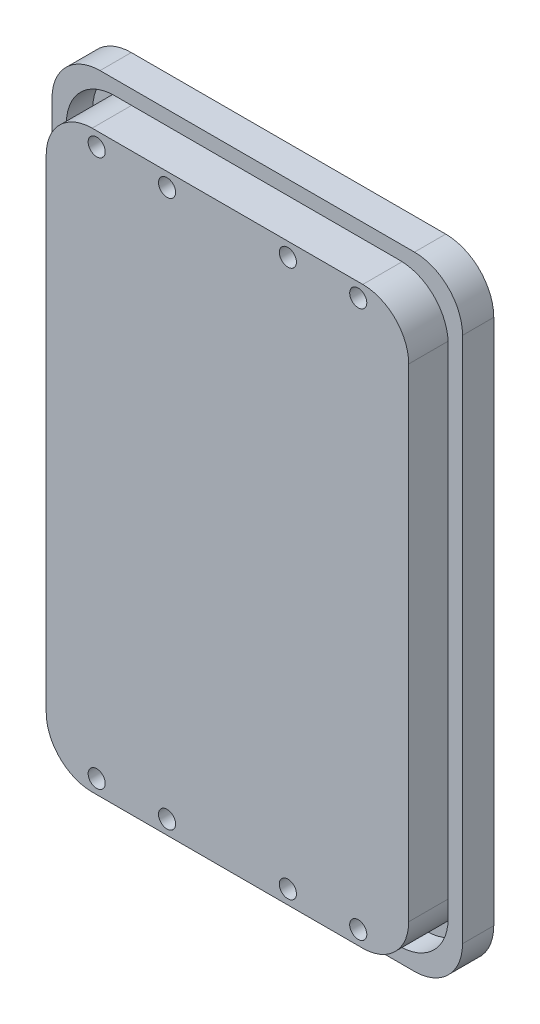
ISO-10303-21;
HEADER;
FILE_DESCRIPTION(('STEP AP214'),'2;1');
FILE_NAME('part.step','',(''),(''),'','','');
FILE_SCHEMA(('AUTOMOTIVE_DESIGN { 1 0 10303 214 1 1 1 1 }'));
ENDSEC;
DATA;
#1=APPLICATION_CONTEXT('core data for automotive mechanical design processes');
#2=APPLICATION_PROTOCOL_DEFINITION('international standard','automotive_design',2000,#1);
#3=PRODUCT_CONTEXT('',#1,'mechanical');
#4=PRODUCT('Part','Part','',(#3));
#5=PRODUCT_RELATED_PRODUCT_CATEGORY('part','',(#4));
#6=PRODUCT_DEFINITION_FORMATION('','',#4);
#7=PRODUCT_DEFINITION_CONTEXT('part definition',#1,'design');
#8=PRODUCT_DEFINITION('design','',#6,#7);
#9=PRODUCT_DEFINITION_SHAPE('','',#8);
#10=(LENGTH_UNIT() NAMED_UNIT(*) SI_UNIT(.MILLI.,.METRE.));
#11=(NAMED_UNIT(*) PLANE_ANGLE_UNIT() SI_UNIT($,.RADIAN.));
#12=(NAMED_UNIT(*) SI_UNIT($,.STERADIAN.) SOLID_ANGLE_UNIT());
#13=UNCERTAINTY_MEASURE_WITH_UNIT(LENGTH_MEASURE(1.E-05),#10,'distance_accuracy_value','');
#14=(GEOMETRIC_REPRESENTATION_CONTEXT(3) GLOBAL_UNCERTAINTY_ASSIGNED_CONTEXT((#13)) GLOBAL_UNIT_ASSIGNED_CONTEXT((#10,
#11,#12)) REPRESENTATION_CONTEXT('',''));
#15=CARTESIAN_POINT('',(0.,0.,0.));
#16=DIRECTION('',(0.,0.,1.));
#17=DIRECTION('',(1.,0.,0.));
#18=AXIS2_PLACEMENT_3D('',#15,#16,#17);
#19=CARTESIAN_POINT('',(0.,61.81,6.5));
#20=DIRECTION('',(0.,1.,0.));
#21=DIRECTION('',(0.,0.,1.));
#22=AXIS2_PLACEMENT_3D('',#19,#20,#21);
#23=PLANE('',#22);
#24=DIRECTION('',(0.,0.,-1.));
#25=VECTOR('',#24,1.);
#26=CARTESIAN_POINT('',(-29.7099999999999,61.81,6.5));
#27=LINE('',#26,#25);
#28=CARTESIAN_POINT('',(-29.7099999999999,61.81,6.5));
#29=VERTEX_POINT('',#28);
#30=CARTESIAN_POINT('',(-29.7099999999999,61.81,1.));
#31=VERTEX_POINT('',#30);
#32=EDGE_CURVE('E358',#29,#31,#27,.T.);
#33=ORIENTED_EDGE('',*,*,#32,.T.);
#34=DIRECTION('',(1.,0.,0.));
#35=VECTOR('',#34,1.);
#36=CARTESIAN_POINT('',(0.,61.81,1.));
#37=LINE('',#36,#35);
#38=CARTESIAN_POINT('',(29.7099999999999,61.81,1.));
#39=VERTEX_POINT('',#38);
#40=EDGE_CURVE('E52',#31,#39,#37,.T.);
#41=ORIENTED_EDGE('',*,*,#40,.T.);
#42=DIRECTION('',(0.,0.,-1.));
#43=VECTOR('',#42,1.);
#44=CARTESIAN_POINT('',(29.7099999999999,61.81,6.5));
#45=LINE('',#44,#43);
#46=CARTESIAN_POINT('',(29.7099999999999,61.81,6.5));
#47=VERTEX_POINT('',#46);
#48=EDGE_CURVE('E11',#47,#39,#45,.T.);
#49=ORIENTED_EDGE('',*,*,#48,.F.);
#50=DIRECTION('',(1.,0.,0.));
#51=VECTOR('',#50,1.);
#52=CARTESIAN_POINT('',(0.,61.81,6.5));
#53=LINE('',#52,#51);
#54=EDGE_CURVE('E317',#29,#47,#53,.T.);
#55=ORIENTED_EDGE('',*,*,#54,.F.);
#56=EDGE_LOOP('',(#33,#41,#49,#55));
#57=FACE_BOUND('',#56,.T.);
#58=ADVANCED_FACE('F35',(#57),#23,.F.);
#59=CARTESIAN_POINT('',(29.71,51.81,6.5));
#60=DIRECTION('',(0.,0.,-1.));
#61=DIRECTION('',(-1.,0.,0.));
#62=AXIS2_PLACEMENT_3D('',#59,#60,#61);
#63=CYLINDRICAL_SURFACE('',#62,10.);
#64=ORIENTED_EDGE('',*,*,#48,.T.);
#65=CARTESIAN_POINT('',(29.71,51.81,1.));
#66=DIRECTION('',(0.,0.,1.));
#67=DIRECTION('',(1.,0.,0.));
#68=AXIS2_PLACEMENT_3D('',#65,#66,#67);
#69=CIRCLE('',#68,10.);
#70=CARTESIAN_POINT('',(39.71,51.81,1.));
#71=VERTEX_POINT('',#70);
#72=EDGE_CURVE('E58',#39,#71,#69,.F.);
#73=ORIENTED_EDGE('',*,*,#72,.T.);
#74=DIRECTION('',(0.,0.,-1.));
#75=VECTOR('',#74,1.);
#76=CARTESIAN_POINT('',(39.71,51.81,6.5));
#77=LINE('',#76,#75);
#78=CARTESIAN_POINT('',(39.71,51.81,6.5));
#79=VERTEX_POINT('',#78);
#80=EDGE_CURVE('E44',#79,#71,#77,.T.);
#81=ORIENTED_EDGE('',*,*,#80,.F.);
#82=CARTESIAN_POINT('',(29.71,51.81,6.5));
#83=DIRECTION('',(0.,0.,1.));
#84=DIRECTION('',(1.,0.,0.));
#85=AXIS2_PLACEMENT_3D('',#82,#83,#84);
#86=CIRCLE('',#85,10.);
#87=EDGE_CURVE('E320',#47,#79,#86,.F.);
#88=ORIENTED_EDGE('',*,*,#87,.F.);
#89=EDGE_LOOP('',(#64,#73,#81,#88));
#90=FACE_BOUND('',#89,.T.);
#91=ADVANCED_FACE('F440',(#90),#63,.F.);
#92=CARTESIAN_POINT('',(39.71,0.,6.5));
#93=DIRECTION('',(1.,0.,0.));
#94=DIRECTION('',(0.,1.,0.));
#95=AXIS2_PLACEMENT_3D('',#92,#93,#94);
#96=PLANE('',#95);
#97=ORIENTED_EDGE('',*,*,#80,.T.);
#98=DIRECTION('',(0.,-1.,0.));
#99=VECTOR('',#98,1.);
#100=CARTESIAN_POINT('',(39.71,0.,1.));
#101=LINE('',#100,#99);
#102=CARTESIAN_POINT('',(39.71,-51.8099999999999,1.));
#103=VERTEX_POINT('',#102);
#104=EDGE_CURVE('E277',#71,#103,#101,.T.);
#105=ORIENTED_EDGE('',*,*,#104,.T.);
#106=DIRECTION('',(0.,0.,-1.));
#107=VECTOR('',#106,1.);
#108=CARTESIAN_POINT('',(39.71,-51.8099999999999,6.5));
#109=LINE('',#108,#107);
#110=CARTESIAN_POINT('',(39.71,-51.8099999999999,6.5));
#111=VERTEX_POINT('',#110);
#112=EDGE_CURVE('E371',#111,#103,#109,.T.);
#113=ORIENTED_EDGE('',*,*,#112,.F.);
#114=DIRECTION('',(0.,-1.,0.));
#115=VECTOR('',#114,1.);
#116=CARTESIAN_POINT('',(39.71,0.,6.5));
#117=LINE('',#116,#115);
#118=EDGE_CURVE('E322',#79,#111,#117,.T.);
#119=ORIENTED_EDGE('',*,*,#118,.F.);
#120=EDGE_LOOP('',(#97,#105,#113,#119));
#121=FACE_BOUND('',#120,.T.);
#122=ADVANCED_FACE('F445',(#121),#96,.F.);
#123=CARTESIAN_POINT('',(29.71,-51.81,6.5));
#124=DIRECTION('',(0.,0.,-1.));
#125=DIRECTION('',(-1.,0.,0.));
#126=AXIS2_PLACEMENT_3D('',#123,#124,#125);
#127=CYLINDRICAL_SURFACE('',#126,10.);
#128=CARTESIAN_POINT('',(29.71,-51.81,1.));
#129=DIRECTION('',(0.,0.,1.));
#130=DIRECTION('',(1.,0.,0.));
#131=AXIS2_PLACEMENT_3D('',#128,#129,#130);
#132=CIRCLE('',#131,10.);
#133=CARTESIAN_POINT('',(29.7099999999999,-61.81,1.));
#134=VERTEX_POINT('',#133);
#135=EDGE_CURVE('E274',#134,#103,#132,.T.);
#136=ORIENTED_EDGE('',*,*,#135,.F.);
#137=DIRECTION('',(0.,0.,-1.));
#138=VECTOR('',#137,1.);
#139=CARTESIAN_POINT('',(29.7099999999999,-61.81,6.5));
#140=LINE('',#139,#138);
#141=CARTESIAN_POINT('',(29.7099999999999,-61.81,6.5));
#142=VERTEX_POINT('',#141);
#143=EDGE_CURVE('E368',#142,#134,#140,.T.);
#144=ORIENTED_EDGE('',*,*,#143,.F.);
#145=CARTESIAN_POINT('',(29.71,-51.81,6.5));
#146=DIRECTION('',(0.,0.,1.));
#147=DIRECTION('',(1.,0.,0.));
#148=AXIS2_PLACEMENT_3D('',#145,#146,#147);
#149=CIRCLE('',#148,10.);
#150=EDGE_CURVE('E324',#142,#111,#149,.T.);
#151=ORIENTED_EDGE('',*,*,#150,.T.);
#152=ORIENTED_EDGE('',*,*,#112,.T.);
#153=EDGE_LOOP('',(#136,#144,#151,#152));
#154=FACE_BOUND('',#153,.T.);
#155=ADVANCED_FACE('F731',(#154),#127,.F.);
#156=CARTESIAN_POINT('',(0.,-61.81,6.5));
#157=DIRECTION('',(0.,1.,0.));
#158=DIRECTION('',(0.,0.,1.));
#159=AXIS2_PLACEMENT_3D('',#156,#157,#158);
#160=PLANE('',#159);
#161=DIRECTION('',(1.,0.,0.));
#162=VECTOR('',#161,1.);
#163=CARTESIAN_POINT('',(0.,-61.81,1.));
#164=LINE('',#163,#162);
#165=CARTESIAN_POINT('',(-29.7099999999999,-61.81,1.));
#166=VERTEX_POINT('',#165);
#167=EDGE_CURVE('E271',#166,#134,#164,.T.);
#168=ORIENTED_EDGE('',*,*,#167,.F.);
#169=DIRECTION('',(0.,0.,-1.));
#170=VECTOR('',#169,1.);
#171=CARTESIAN_POINT('',(-29.7099999999999,-61.81,6.5));
#172=LINE('',#171,#170);
#173=CARTESIAN_POINT('',(-29.7099999999999,-61.81,6.5));
#174=VERTEX_POINT('',#173);
#175=EDGE_CURVE('E365',#174,#166,#172,.T.);
#176=ORIENTED_EDGE('',*,*,#175,.F.);
#177=DIRECTION('',(1.,0.,0.));
#178=VECTOR('',#177,1.);
#179=CARTESIAN_POINT('',(0.,-61.81,6.5));
#180=LINE('',#179,#178);
#181=EDGE_CURVE('E327',#174,#142,#180,.T.);
#182=ORIENTED_EDGE('',*,*,#181,.T.);
#183=ORIENTED_EDGE('',*,*,#143,.T.);
#184=EDGE_LOOP('',(#168,#176,#182,#183));
#185=FACE_BOUND('',#184,.T.);
#186=ADVANCED_FACE('F722',(#185),#160,.T.);
#187=CARTESIAN_POINT('',(-29.71,-51.81,6.5));
#188=DIRECTION('',(0.,0.,-1.));
#189=DIRECTION('',(-1.,0.,0.));
#190=AXIS2_PLACEMENT_3D('',#187,#188,#189);
#191=CYLINDRICAL_SURFACE('',#190,10.);
#192=CARTESIAN_POINT('',(-29.71,-51.81,1.));
#193=DIRECTION('',(0.,0.,1.));
#194=DIRECTION('',(1.,0.,0.));
#195=AXIS2_PLACEMENT_3D('',#192,#193,#194);
#196=CIRCLE('',#195,10.);
#197=CARTESIAN_POINT('',(-39.71,-51.8099999999999,1.));
#198=VERTEX_POINT('',#197);
#199=EDGE_CURVE('E268',#198,#166,#196,.T.);
#200=ORIENTED_EDGE('',*,*,#199,.F.);
#201=DIRECTION('',(0.,0.,-1.));
#202=VECTOR('',#201,1.);
#203=CARTESIAN_POINT('',(-39.71,-51.8099999999999,6.5));
#204=LINE('',#203,#202);
#205=CARTESIAN_POINT('',(-39.71,-51.8099999999999,6.5));
#206=VERTEX_POINT('',#205);
#207=EDGE_CURVE('E362',#206,#198,#204,.T.);
#208=ORIENTED_EDGE('',*,*,#207,.F.);
#209=CARTESIAN_POINT('',(-29.71,-51.81,6.5));
#210=DIRECTION('',(0.,0.,1.));
#211=DIRECTION('',(1.,0.,0.));
#212=AXIS2_PLACEMENT_3D('',#209,#210,#211);
#213=CIRCLE('',#212,10.);
#214=EDGE_CURVE('E330',#206,#174,#213,.T.);
#215=ORIENTED_EDGE('',*,*,#214,.T.);
#216=ORIENTED_EDGE('',*,*,#175,.T.);
#217=EDGE_LOOP('',(#200,#208,#215,#216));
#218=FACE_BOUND('',#217,.T.);
#219=ADVANCED_FACE('F713',(#218),#191,.F.);
#220=CARTESIAN_POINT('',(-39.71,0.,6.5));
#221=DIRECTION('',(1.,0.,0.));
#222=DIRECTION('',(0.,1.,0.));
#223=AXIS2_PLACEMENT_3D('',#220,#221,#222);
#224=PLANE('',#223);
#225=DIRECTION('',(0.,-1.,0.));
#226=VECTOR('',#225,1.);
#227=CARTESIAN_POINT('',(-39.71,0.,1.));
#228=LINE('',#227,#226);
#229=CARTESIAN_POINT('',(-39.71,51.81,1.));
#230=VERTEX_POINT('',#229);
#231=EDGE_CURVE('E265',#230,#198,#228,.T.);
#232=ORIENTED_EDGE('',*,*,#231,.F.);
#233=DIRECTION('',(0.,0.,-1.));
#234=VECTOR('',#233,1.);
#235=CARTESIAN_POINT('',(-39.71,51.81,6.5));
#236=LINE('',#235,#234);
#237=CARTESIAN_POINT('',(-39.71,51.81,6.5));
#238=VERTEX_POINT('',#237);
#239=EDGE_CURVE('E360',#238,#230,#236,.T.);
#240=ORIENTED_EDGE('',*,*,#239,.F.);
#241=DIRECTION('',(0.,-1.,0.));
#242=VECTOR('',#241,1.);
#243=CARTESIAN_POINT('',(-39.71,0.,6.5));
#244=LINE('',#243,#242);
#245=EDGE_CURVE('E333',#238,#206,#244,.T.);
#246=ORIENTED_EDGE('',*,*,#245,.T.);
#247=ORIENTED_EDGE('',*,*,#207,.T.);
#248=EDGE_LOOP('',(#232,#240,#246,#247));
#249=FACE_BOUND('',#248,.T.);
#250=ADVANCED_FACE('F707',(#249),#224,.T.);
#251=CARTESIAN_POINT('',(32.71,54.81,6.5));
#252=DIRECTION('',(0.,0.,-1.));
#253=DIRECTION('',(-1.,0.,0.));
#254=AXIS2_PLACEMENT_3D('',#251,#252,#253);
#255=CYLINDRICAL_SURFACE('',#254,10.);
#256=CARTESIAN_POINT('',(32.71,54.81,0.));
#257=DIRECTION('',(0.,0.,1.));
#258=DIRECTION('',(1.,0.,0.));
#259=AXIS2_PLACEMENT_3D('',#256,#257,#258);
#260=CIRCLE('',#259,10.);
#261=CARTESIAN_POINT('',(32.7099999999999,64.81,0.));
#262=VERTEX_POINT('',#261);
#263=CARTESIAN_POINT('',(42.71,54.8099999999999,0.));
#264=VERTEX_POINT('',#263);
#265=EDGE_CURVE('E296',#262,#264,#260,.F.);
#266=ORIENTED_EDGE('',*,*,#265,.F.);
#267=DIRECTION('',(0.,0.,-1.));
#268=VECTOR('',#267,1.);
#269=CARTESIAN_POINT('',(32.7099999999999,64.81,6.5));
#270=LINE('',#269,#268);
#271=CARTESIAN_POINT('',(32.7099999999999,64.81,6.5));
#272=VERTEX_POINT('',#271);
#273=EDGE_CURVE('E39',#272,#262,#270,.T.);
#274=ORIENTED_EDGE('',*,*,#273,.F.);
#275=CARTESIAN_POINT('',(32.71,54.81,6.5));
#276=DIRECTION('',(0.,0.,1.));
#277=DIRECTION('',(1.,0.,0.));
#278=AXIS2_PLACEMENT_3D('',#275,#276,#277);
#279=CIRCLE('',#278,10.);
#280=CARTESIAN_POINT('',(42.71,54.8099999999999,6.5));
#281=VERTEX_POINT('',#280);
#282=EDGE_CURVE('E297',#272,#281,#279,.F.);
#283=ORIENTED_EDGE('',*,*,#282,.T.);
#284=DIRECTION('',(0.,0.,-1.));
#285=VECTOR('',#284,1.);
#286=CARTESIAN_POINT('',(42.71,54.8099999999999,6.5));
#287=LINE('',#286,#285);
#288=EDGE_CURVE('E339',#281,#264,#287,.T.);
#289=ORIENTED_EDGE('',*,*,#288,.T.);
#290=EDGE_LOOP('',(#266,#274,#283,#289));
#291=FACE_BOUND('',#290,.T.);
#292=ADVANCED_FACE('F37',(#291),#255,.T.);
#293=CARTESIAN_POINT('',(0.,64.81,6.5));
#294=DIRECTION('',(0.,1.,0.));
#295=DIRECTION('',(0.,0.,1.));
#296=AXIS2_PLACEMENT_3D('',#293,#294,#295);
#297=PLANE('',#296);
#298=DIRECTION('',(1.,0.,0.));
#299=VECTOR('',#298,1.);
#300=CARTESIAN_POINT('',(0.,64.81,0.));
#301=LINE('',#300,#299);
#302=CARTESIAN_POINT('',(-32.7099999999999,64.81,0.));
#303=VERTEX_POINT('',#302);
#304=EDGE_CURVE('E342',#303,#262,#301,.T.);
#305=ORIENTED_EDGE('',*,*,#304,.F.);
#306=DIRECTION('',(0.,0.,-1.));
#307=VECTOR('',#306,1.);
#308=CARTESIAN_POINT('',(-32.7099999999999,64.81,6.5));
#309=LINE('',#308,#307);
#310=CARTESIAN_POINT('',(-32.7099999999999,64.81,6.5));
#311=VERTEX_POINT('',#310);
#312=EDGE_CURVE('E389',#311,#303,#309,.T.);
#313=ORIENTED_EDGE('',*,*,#312,.F.);
#314=DIRECTION('',(1.,0.,0.));
#315=VECTOR('',#314,1.);
#316=CARTESIAN_POINT('',(0.,64.81,6.5));
#317=LINE('',#316,#315);
#318=EDGE_CURVE('E300',#311,#272,#317,.T.);
#319=ORIENTED_EDGE('',*,*,#318,.T.);
#320=ORIENTED_EDGE('',*,*,#273,.T.);
#321=EDGE_LOOP('',(#305,#313,#319,#320));
#322=FACE_BOUND('',#321,.T.);
#323=ADVANCED_FACE('F396',(#322),#297,.T.);
#324=CARTESIAN_POINT('',(-32.71,54.81,6.5));
#325=DIRECTION('',(0.,0.,-1.));
#326=DIRECTION('',(-1.,0.,0.));
#327=AXIS2_PLACEMENT_3D('',#324,#325,#326);
#328=CYLINDRICAL_SURFACE('',#327,10.);
#329=CARTESIAN_POINT('',(-32.71,54.81,0.));
#330=DIRECTION('',(0.,0.,1.));
#331=DIRECTION('',(1.,0.,0.));
#332=AXIS2_PLACEMENT_3D('',#329,#330,#331);
#333=CIRCLE('',#332,10.);
#334=CARTESIAN_POINT('',(-42.71,54.8099999999999,0.));
#335=VERTEX_POINT('',#334);
#336=EDGE_CURVE('E345',#303,#335,#333,.T.);
#337=ORIENTED_EDGE('',*,*,#336,.T.);
#338=DIRECTION('',(0.,0.,-1.));
#339=VECTOR('',#338,1.);
#340=CARTESIAN_POINT('',(-42.71,54.8099999999999,6.5));
#341=LINE('',#340,#339);
#342=CARTESIAN_POINT('',(-42.71,54.8099999999999,6.5));
#343=VERTEX_POINT('',#342);
#344=EDGE_CURVE('E387',#343,#335,#341,.T.);
#345=ORIENTED_EDGE('',*,*,#344,.F.);
#346=CARTESIAN_POINT('',(-32.71,54.81,6.5));
#347=DIRECTION('',(0.,0.,1.));
#348=DIRECTION('',(1.,0.,0.));
#349=AXIS2_PLACEMENT_3D('',#346,#347,#348);
#350=CIRCLE('',#349,10.);
#351=EDGE_CURVE('E304',#311,#343,#350,.T.);
#352=ORIENTED_EDGE('',*,*,#351,.F.);
#353=ORIENTED_EDGE('',*,*,#312,.T.);
#354=EDGE_LOOP('',(#337,#345,#352,#353));
#355=FACE_BOUND('',#354,.T.);
#356=ADVANCED_FACE('F406',(#355),#328,.T.);
#357=CARTESIAN_POINT('',(-42.71,0.,6.5));
#358=DIRECTION('',(1.,0.,0.));
#359=DIRECTION('',(0.,1.,0.));
#360=AXIS2_PLACEMENT_3D('',#357,#358,#359);
#361=PLANE('',#360);
#362=DIRECTION('',(0.,-1.,0.));
#363=VECTOR('',#362,1.);
#364=CARTESIAN_POINT('',(-42.71,0.,0.));
#365=LINE('',#364,#363);
#366=CARTESIAN_POINT('',(-42.71,-54.81,0.));
#367=VERTEX_POINT('',#366);
#368=EDGE_CURVE('E347',#335,#367,#365,.T.);
#369=ORIENTED_EDGE('',*,*,#368,.T.);
#370=DIRECTION('',(0.,0.,-1.));
#371=VECTOR('',#370,1.);
#372=CARTESIAN_POINT('',(-42.71,-54.81,6.5));
#373=LINE('',#372,#371);
#374=CARTESIAN_POINT('',(-42.71,-54.81,6.5));
#375=VERTEX_POINT('',#374);
#376=EDGE_CURVE('E384',#375,#367,#373,.T.);
#377=ORIENTED_EDGE('',*,*,#376,.F.);
#378=DIRECTION('',(0.,-1.,0.));
#379=VECTOR('',#378,1.);
#380=CARTESIAN_POINT('',(-42.71,0.,6.5));
#381=LINE('',#380,#379);
#382=EDGE_CURVE('E306',#343,#375,#381,.T.);
#383=ORIENTED_EDGE('',*,*,#382,.F.);
#384=ORIENTED_EDGE('',*,*,#344,.T.);
#385=EDGE_LOOP('',(#369,#377,#383,#384));
#386=FACE_BOUND('',#385,.T.);
#387=ADVANCED_FACE('F409',(#386),#361,.F.);
#388=CARTESIAN_POINT('',(-32.71,-54.81,6.5));
#389=DIRECTION('',(0.,0.,-1.));
#390=DIRECTION('',(-1.,0.,0.));
#391=AXIS2_PLACEMENT_3D('',#388,#389,#390);
#392=CYLINDRICAL_SURFACE('',#391,10.);
#393=CARTESIAN_POINT('',(-32.71,-54.81,0.));
#394=DIRECTION('',(0.,0.,1.));
#395=DIRECTION('',(1.,0.,0.));
#396=AXIS2_PLACEMENT_3D('',#393,#394,#395);
#397=CIRCLE('',#396,10.);
#398=CARTESIAN_POINT('',(-32.7099999999999,-64.81,0.));
#399=VERTEX_POINT('',#398);
#400=EDGE_CURVE('E349',#367,#399,#397,.T.);
#401=ORIENTED_EDGE('',*,*,#400,.T.);
#402=DIRECTION('',(0.,0.,-1.));
#403=VECTOR('',#402,1.);
#404=CARTESIAN_POINT('',(-32.7099999999999,-64.81,6.5));
#405=LINE('',#404,#403);
#406=CARTESIAN_POINT('',(-32.7099999999999,-64.81,6.5));
#407=VERTEX_POINT('',#406);
#408=EDGE_CURVE('E381',#407,#399,#405,.T.);
#409=ORIENTED_EDGE('',*,*,#408,.F.);
#410=CARTESIAN_POINT('',(-32.71,-54.81,6.5));
#411=DIRECTION('',(0.,0.,1.));
#412=DIRECTION('',(1.,0.,0.));
#413=AXIS2_PLACEMENT_3D('',#410,#411,#412);
#414=CIRCLE('',#413,10.);
#415=EDGE_CURVE('E308',#375,#407,#414,.T.);
#416=ORIENTED_EDGE('',*,*,#415,.F.);
#417=ORIENTED_EDGE('',*,*,#376,.T.);
#418=EDGE_LOOP('',(#401,#409,#416,#417));
#419=FACE_BOUND('',#418,.T.);
#420=ADVANCED_FACE('F430',(#419),#392,.T.);
#421=CARTESIAN_POINT('',(0.,-64.81,6.5));
#422=DIRECTION('',(0.,1.,0.));
#423=DIRECTION('',(0.,0.,1.));
#424=AXIS2_PLACEMENT_3D('',#421,#422,#423);
#425=PLANE('',#424);
#426=DIRECTION('',(1.,0.,0.));
#427=VECTOR('',#426,1.);
#428=CARTESIAN_POINT('',(0.,-64.81,0.));
#429=LINE('',#428,#427);
#430=CARTESIAN_POINT('',(32.7099999999999,-64.81,0.));
#431=VERTEX_POINT('',#430);
#432=EDGE_CURVE('E351',#399,#431,#429,.T.);
#433=ORIENTED_EDGE('',*,*,#432,.T.);
#434=DIRECTION('',(0.,0.,-1.));
#435=VECTOR('',#434,1.);
#436=CARTESIAN_POINT('',(32.7099999999999,-64.81,6.5));
#437=LINE('',#436,#435);
#438=CARTESIAN_POINT('',(32.7099999999999,-64.81,6.5));
#439=VERTEX_POINT('',#438);
#440=EDGE_CURVE('E378',#439,#431,#437,.T.);
#441=ORIENTED_EDGE('',*,*,#440,.F.);
#442=DIRECTION('',(1.,0.,0.));
#443=VECTOR('',#442,1.);
#444=CARTESIAN_POINT('',(0.,-64.81,6.5));
#445=LINE('',#444,#443);
#446=EDGE_CURVE('E310',#407,#439,#445,.T.);
#447=ORIENTED_EDGE('',*,*,#446,.F.);
#448=ORIENTED_EDGE('',*,*,#408,.T.);
#449=EDGE_LOOP('',(#433,#441,#447,#448));
#450=FACE_BOUND('',#449,.T.);
#451=ADVANCED_FACE('F428',(#450),#425,.F.);
#452=CARTESIAN_POINT('',(32.71,-54.81,6.5));
#453=DIRECTION('',(0.,0.,-1.));
#454=DIRECTION('',(-1.,0.,0.));
#455=AXIS2_PLACEMENT_3D('',#452,#453,#454);
#456=CYLINDRICAL_SURFACE('',#455,10.);
#457=CARTESIAN_POINT('',(32.71,-54.81,0.));
#458=DIRECTION('',(0.,0.,1.));
#459=DIRECTION('',(1.,0.,0.));
#460=AXIS2_PLACEMENT_3D('',#457,#458,#459);
#461=CIRCLE('',#460,10.);
#462=CARTESIAN_POINT('',(42.71,-54.81,0.));
#463=VERTEX_POINT('',#462);
#464=EDGE_CURVE('E353',#431,#463,#461,.T.);
#465=ORIENTED_EDGE('',*,*,#464,.T.);
#466=DIRECTION('',(0.,0.,-1.));
#467=VECTOR('',#466,1.);
#468=CARTESIAN_POINT('',(42.71,-54.81,6.5));
#469=LINE('',#468,#467);
#470=CARTESIAN_POINT('',(42.71,-54.81,6.5));
#471=VERTEX_POINT('',#470);
#472=EDGE_CURVE('E376',#471,#463,#469,.T.);
#473=ORIENTED_EDGE('',*,*,#472,.F.);
#474=CARTESIAN_POINT('',(32.71,-54.81,6.5));
#475=DIRECTION('',(0.,0.,1.));
#476=DIRECTION('',(1.,0.,0.));
#477=AXIS2_PLACEMENT_3D('',#474,#475,#476);
#478=CIRCLE('',#477,10.);
#479=EDGE_CURVE('E312',#439,#471,#478,.T.);
#480=ORIENTED_EDGE('',*,*,#479,.F.);
#481=ORIENTED_EDGE('',*,*,#440,.T.);
#482=EDGE_LOOP('',(#465,#473,#480,#481));
#483=FACE_BOUND('',#482,.T.);
#484=ADVANCED_FACE('F424',(#483),#456,.T.);
#485=CARTESIAN_POINT('',(42.71,0.,6.5));
#486=DIRECTION('',(1.,0.,0.));
#487=DIRECTION('',(0.,1.,0.));
#488=AXIS2_PLACEMENT_3D('',#485,#486,#487);
#489=PLANE('',#488);
#490=DIRECTION('',(0.,-1.,0.));
#491=VECTOR('',#490,1.);
#492=CARTESIAN_POINT('',(42.71,0.,0.));
#493=LINE('',#492,#491);
#494=EDGE_CURVE('E301',#264,#463,#493,.T.);
#495=ORIENTED_EDGE('',*,*,#494,.F.);
#496=ORIENTED_EDGE('',*,*,#288,.F.);
#497=DIRECTION('',(0.,-1.,0.));
#498=VECTOR('',#497,1.);
#499=CARTESIAN_POINT('',(42.71,0.,6.5));
#500=LINE('',#499,#498);
#501=EDGE_CURVE('E314',#281,#471,#500,.T.);
#502=ORIENTED_EDGE('',*,*,#501,.T.);
#503=ORIENTED_EDGE('',*,*,#472,.T.);
#504=EDGE_LOOP('',(#495,#496,#502,#503));
#505=FACE_BOUND('',#504,.T.);
#506=ADVANCED_FACE('F420',(#505),#489,.T.);
#507=CARTESIAN_POINT('',(-29.71,51.81,6.5));
#508=DIRECTION('',(0.,0.,-1.));
#509=DIRECTION('',(-1.,0.,0.));
#510=AXIS2_PLACEMENT_3D('',#507,#508,#509);
#511=CYLINDRICAL_SURFACE('',#510,10.);
#512=CARTESIAN_POINT('',(-29.71,51.81,1.));
#513=DIRECTION('',(0.,0.,1.));
#514=DIRECTION('',(1.,0.,0.));
#515=AXIS2_PLACEMENT_3D('',#512,#513,#514);
#516=CIRCLE('',#515,10.);
#517=EDGE_CURVE('E262',#31,#230,#516,.T.);
#518=ORIENTED_EDGE('',*,*,#517,.F.);
#519=ORIENTED_EDGE('',*,*,#32,.F.);
#520=CARTESIAN_POINT('',(-29.71,51.81,6.5));
#521=DIRECTION('',(0.,0.,1.));
#522=DIRECTION('',(1.,0.,0.));
#523=AXIS2_PLACEMENT_3D('',#520,#521,#522);
#524=CIRCLE('',#523,10.);
#525=EDGE_CURVE('E336',#29,#238,#524,.T.);
#526=ORIENTED_EDGE('',*,*,#525,.T.);
#527=ORIENTED_EDGE('',*,*,#239,.T.);
#528=EDGE_LOOP('',(#518,#519,#526,#527));
#529=FACE_BOUND('',#528,.T.);
#530=ADVANCED_FACE('F451',(#529),#511,.F.);
#531=CARTESIAN_POINT('',(0.,0.,6.5));
#532=DIRECTION('',(0.,0.,1.));
#533=DIRECTION('',(1.,0.,0.));
#534=AXIS2_PLACEMENT_3D('',#531,#532,#533);
#535=PLANE('',#534);
#536=ORIENTED_EDGE('',*,*,#282,.F.);
#537=ORIENTED_EDGE('',*,*,#318,.F.);
#538=ORIENTED_EDGE('',*,*,#351,.T.);
#539=ORIENTED_EDGE('',*,*,#382,.T.);
#540=ORIENTED_EDGE('',*,*,#415,.T.);
#541=ORIENTED_EDGE('',*,*,#446,.T.);
#542=ORIENTED_EDGE('',*,*,#479,.T.);
#543=ORIENTED_EDGE('',*,*,#501,.F.);
#544=EDGE_LOOP('',(#536,#537,#538,#539,#540,#541,#542,#543));
#545=FACE_BOUND('',#544,.T.);
#546=ORIENTED_EDGE('',*,*,#54,.T.);
#547=ORIENTED_EDGE('',*,*,#87,.T.);
#548=ORIENTED_EDGE('',*,*,#118,.T.);
#549=ORIENTED_EDGE('',*,*,#150,.F.);
#550=ORIENTED_EDGE('',*,*,#181,.F.);
#551=ORIENTED_EDGE('',*,*,#214,.F.);
#552=ORIENTED_EDGE('',*,*,#245,.F.);
#553=ORIENTED_EDGE('',*,*,#525,.F.);
#554=EDGE_LOOP('',(#546,#547,#548,#549,#550,#551,#552,#553));
#555=FACE_BOUND('',#554,.T.);
#556=ADVANCED_FACE('F413',(#545,#555),#535,.T.);
#557=CARTESIAN_POINT('',(0.,0.,0.));
#558=DIRECTION('',(0.,0.,1.));
#559=DIRECTION('',(1.,0.,0.));
#560=AXIS2_PLACEMENT_3D('',#557,#558,#559);
#561=PLANE('',#560);
#562=CARTESIAN_POINT('',(-12.57,56.91,0.));
#563=DIRECTION('',(0.,0.,-1.));
#564=DIRECTION('',(-1.,0.,0.));
#565=AXIS2_PLACEMENT_3D('',#562,#563,#564);
#566=CIRCLE('',#565,1.78);
#567=CARTESIAN_POINT('',(-14.35,56.91,0.));
#568=VERTEX_POINT('',#567);
#569=EDGE_CURVE('E797',#568,#568,#566,.T.);
#570=ORIENTED_EDGE('',*,*,#569,.F.);
#571=EDGE_LOOP('',(#570));
#572=FACE_BOUND('',#571,.T.);
#573=CARTESIAN_POINT('',(12.57,56.91,0.));
#574=DIRECTION('',(0.,0.,-1.));
#575=DIRECTION('',(-1.,0.,0.));
#576=AXIS2_PLACEMENT_3D('',#573,#574,#575);
#577=CIRCLE('',#576,1.78);
#578=CARTESIAN_POINT('',(10.79,56.91,0.));
#579=VERTEX_POINT('',#578);
#580=EDGE_CURVE('E802',#579,#579,#577,.T.);
#581=ORIENTED_EDGE('',*,*,#580,.F.);
#582=EDGE_LOOP('',(#581));
#583=FACE_BOUND('',#582,.T.);
#584=CARTESIAN_POINT('',(27.21,56.91,0.));
#585=DIRECTION('',(0.,0.,-1.));
#586=DIRECTION('',(-1.,0.,0.));
#587=AXIS2_PLACEMENT_3D('',#584,#585,#586);
#588=CIRCLE('',#587,1.78);
#589=CARTESIAN_POINT('',(25.43,56.91,0.));
#590=VERTEX_POINT('',#589);
#591=EDGE_CURVE('E810',#590,#590,#588,.T.);
#592=ORIENTED_EDGE('',*,*,#591,.F.);
#593=EDGE_LOOP('',(#592));
#594=FACE_BOUND('',#593,.T.);
#595=CARTESIAN_POINT('',(-27.21,-56.91,0.));
#596=DIRECTION('',(0.,0.,-1.));
#597=DIRECTION('',(-1.,0.,0.));
#598=AXIS2_PLACEMENT_3D('',#595,#596,#597);
#599=CIRCLE('',#598,1.78);
#600=CARTESIAN_POINT('',(-28.99,-56.91,0.));
#601=VERTEX_POINT('',#600);
#602=EDGE_CURVE('E816',#601,#601,#599,.T.);
#603=ORIENTED_EDGE('',*,*,#602,.F.);
#604=EDGE_LOOP('',(#603));
#605=FACE_BOUND('',#604,.T.);
#606=CARTESIAN_POINT('',(-12.57,-56.91,0.));
#607=DIRECTION('',(0.,0.,-1.));
#608=DIRECTION('',(-1.,0.,0.));
#609=AXIS2_PLACEMENT_3D('',#606,#607,#608);
#610=CIRCLE('',#609,1.78);
#611=CARTESIAN_POINT('',(-14.35,-56.91,0.));
#612=VERTEX_POINT('',#611);
#613=EDGE_CURVE('E822',#612,#612,#610,.T.);
#614=ORIENTED_EDGE('',*,*,#613,.F.);
#615=EDGE_LOOP('',(#614));
#616=FACE_BOUND('',#615,.T.);
#617=CARTESIAN_POINT('',(12.57,-56.91,0.));
#618=DIRECTION('',(0.,0.,-1.));
#619=DIRECTION('',(-1.,0.,0.));
#620=AXIS2_PLACEMENT_3D('',#617,#618,#619);
#621=CIRCLE('',#620,1.78);
#622=CARTESIAN_POINT('',(10.79,-56.91,0.));
#623=VERTEX_POINT('',#622);
#624=EDGE_CURVE('E828',#623,#623,#621,.T.);
#625=ORIENTED_EDGE('',*,*,#624,.F.);
#626=EDGE_LOOP('',(#625));
#627=FACE_BOUND('',#626,.T.);
#628=CARTESIAN_POINT('',(27.21,-56.91,0.));
#629=DIRECTION('',(0.,0.,-1.));
#630=DIRECTION('',(-1.,0.,0.));
#631=AXIS2_PLACEMENT_3D('',#628,#629,#630);
#632=CIRCLE('',#631,1.78);
#633=CARTESIAN_POINT('',(25.43,-56.91,0.));
#634=VERTEX_POINT('',#633);
#635=EDGE_CURVE('E834',#634,#634,#632,.T.);
#636=ORIENTED_EDGE('',*,*,#635,.F.);
#637=EDGE_LOOP('',(#636));
#638=FACE_BOUND('',#637,.T.);
#639=CARTESIAN_POINT('',(-27.21,56.91,0.));
#640=DIRECTION('',(0.,0.,-1.));
#641=DIRECTION('',(-1.,0.,0.));
#642=AXIS2_PLACEMENT_3D('',#639,#640,#641);
#643=CIRCLE('',#642,1.78);
#644=CARTESIAN_POINT('',(-28.99,56.91,0.));
#645=VERTEX_POINT('',#644);
#646=EDGE_CURVE('E228',#645,#645,#643,.T.);
#647=ORIENTED_EDGE('',*,*,#646,.F.);
#648=EDGE_LOOP('',(#647));
#649=FACE_BOUND('',#648,.T.);
#650=ORIENTED_EDGE('',*,*,#265,.T.);
#651=ORIENTED_EDGE('',*,*,#494,.T.);
#652=ORIENTED_EDGE('',*,*,#464,.F.);
#653=ORIENTED_EDGE('',*,*,#432,.F.);
#654=ORIENTED_EDGE('',*,*,#400,.F.);
#655=ORIENTED_EDGE('',*,*,#368,.F.);
#656=ORIENTED_EDGE('',*,*,#336,.F.);
#657=ORIENTED_EDGE('',*,*,#304,.T.);
#658=EDGE_LOOP('',(#650,#651,#652,#653,#654,#655,#656,#657));
#659=FACE_BOUND('',#658,.T.);
#660=ADVANCED_FACE('F402',(#572,#583,#594,#605,#616,#627,#638,#649,#659),#561,.F.);
#661=CARTESIAN_POINT('',(0.,0.,1.));
#662=DIRECTION('',(0.,0.,1.));
#663=DIRECTION('',(1.,0.,0.));
#664=AXIS2_PLACEMENT_3D('',#661,#662,#663);
#665=PLANE('',#664);
#666=ORIENTED_EDGE('',*,*,#72,.F.);
#667=ORIENTED_EDGE('',*,*,#40,.F.);
#668=ORIENTED_EDGE('',*,*,#517,.T.);
#669=ORIENTED_EDGE('',*,*,#231,.T.);
#670=ORIENTED_EDGE('',*,*,#199,.T.);
#671=ORIENTED_EDGE('',*,*,#167,.T.);
#672=ORIENTED_EDGE('',*,*,#135,.T.);
#673=ORIENTED_EDGE('',*,*,#104,.F.);
#674=EDGE_LOOP('',(#666,#667,#668,#669,#670,#671,#672,#673));
#675=FACE_BOUND('',#674,.T.);
#676=CARTESIAN_POINT('',(-28.1566,50.2566,1.));
#677=DIRECTION('',(0.,0.,1.));
#678=DIRECTION('',(1.,0.,0.));
#679=AXIS2_PLACEMENT_3D('',#676,#677,#678);
#680=CIRCLE('',#679,9.5534);
#681=CARTESIAN_POINT('',(-28.1565999999999,59.81,1.));
#682=VERTEX_POINT('',#681);
#683=CARTESIAN_POINT('',(-37.71,50.2565999999999,1.));
#684=VERTEX_POINT('',#683);
#685=EDGE_CURVE('E279',#682,#684,#680,.T.);
#686=ORIENTED_EDGE('',*,*,#685,.F.);
#687=DIRECTION('',(1.,0.,0.));
#688=VECTOR('',#687,1.);
#689=CARTESIAN_POINT('',(0.,59.81,1.));
#690=LINE('',#689,#688);
#691=CARTESIAN_POINT('',(28.1565999999999,59.81,1.));
#692=VERTEX_POINT('',#691);
#693=EDGE_CURVE('E208',#682,#692,#690,.T.);
#694=ORIENTED_EDGE('',*,*,#693,.T.);
#695=CARTESIAN_POINT('',(28.1566,50.2566,1.));
#696=DIRECTION('',(0.,0.,1.));
#697=DIRECTION('',(1.,0.,0.));
#698=AXIS2_PLACEMENT_3D('',#695,#696,#697);
#699=CIRCLE('',#698,9.5534);
#700=CARTESIAN_POINT('',(37.71,50.2565999999999,1.));
#701=VERTEX_POINT('',#700);
#702=EDGE_CURVE('E282',#692,#701,#699,.F.);
#703=ORIENTED_EDGE('',*,*,#702,.T.);
#704=DIRECTION('',(0.,-1.,0.));
#705=VECTOR('',#704,1.);
#706=CARTESIAN_POINT('',(37.71,0.,1.));
#707=LINE('',#706,#705);
#708=CARTESIAN_POINT('',(37.71,-50.2565999999999,1.));
#709=VERTEX_POINT('',#708);
#710=EDGE_CURVE('E285',#701,#709,#707,.T.);
#711=ORIENTED_EDGE('',*,*,#710,.T.);
#712=CARTESIAN_POINT('',(28.1566,-50.2566,1.));
#713=DIRECTION('',(0.,0.,1.));
#714=DIRECTION('',(1.,0.,0.));
#715=AXIS2_PLACEMENT_3D('',#712,#713,#714);
#716=CIRCLE('',#715,9.5534);
#717=CARTESIAN_POINT('',(28.1565999999999,-59.81,1.));
#718=VERTEX_POINT('',#717);
#719=EDGE_CURVE('E288',#718,#709,#716,.T.);
#720=ORIENTED_EDGE('',*,*,#719,.F.);
#721=DIRECTION('',(1.,0.,0.));
#722=VECTOR('',#721,1.);
#723=CARTESIAN_POINT('',(0.,-59.81,1.));
#724=LINE('',#723,#722);
#725=CARTESIAN_POINT('',(-28.1565999999999,-59.81,1.));
#726=VERTEX_POINT('',#725);
#727=EDGE_CURVE('E290',#726,#718,#724,.T.);
#728=ORIENTED_EDGE('',*,*,#727,.F.);
#729=CARTESIAN_POINT('',(-28.1566,-50.2566,1.));
#730=DIRECTION('',(0.,0.,1.));
#731=DIRECTION('',(1.,0.,0.));
#732=AXIS2_PLACEMENT_3D('',#729,#730,#731);
#733=CIRCLE('',#732,9.5534);
#734=CARTESIAN_POINT('',(-37.71,-50.2565999999999,1.));
#735=VERTEX_POINT('',#734);
#736=EDGE_CURVE('E292',#735,#726,#733,.T.);
#737=ORIENTED_EDGE('',*,*,#736,.F.);
#738=DIRECTION('',(0.,-1.,0.));
#739=VECTOR('',#738,1.);
#740=CARTESIAN_POINT('',(-37.71,0.,1.));
#741=LINE('',#740,#739);
#742=EDGE_CURVE('E294',#684,#735,#741,.T.);
#743=ORIENTED_EDGE('',*,*,#742,.F.);
#744=EDGE_LOOP('',(#686,#694,#703,#711,#720,#728,#737,#743));
#745=FACE_BOUND('',#744,.T.);
#746=ADVANCED_FACE('F482',(#675,#745),#665,.T.);
#747=CARTESIAN_POINT('',(0.,0.,12.7));
#748=DIRECTION('',(0.,0.,1.));
#749=DIRECTION('',(1.,0.,0.));
#750=AXIS2_PLACEMENT_3D('',#747,#748,#749);
#751=PLANE('',#750);
#752=CARTESIAN_POINT('',(-12.57,56.91,12.7));
#753=DIRECTION('',(0.,0.,-1.));
#754=DIRECTION('',(-1.,0.,0.));
#755=AXIS2_PLACEMENT_3D('',#752,#753,#754);
#756=CIRCLE('',#755,1.78);
#757=CARTESIAN_POINT('',(-14.35,56.91,12.7));
#758=VERTEX_POINT('',#757);
#759=EDGE_CURVE('E794',#758,#758,#756,.T.);
#760=ORIENTED_EDGE('',*,*,#759,.T.);
#761=EDGE_LOOP('',(#760));
#762=FACE_BOUND('',#761,.T.);
#763=CARTESIAN_POINT('',(12.57,56.91,12.7));
#764=DIRECTION('',(0.,0.,-1.));
#765=DIRECTION('',(-1.,0.,0.));
#766=AXIS2_PLACEMENT_3D('',#763,#764,#765);
#767=CIRCLE('',#766,1.78);
#768=CARTESIAN_POINT('',(10.79,56.91,12.7));
#769=VERTEX_POINT('',#768);
#770=EDGE_CURVE('E798',#769,#769,#767,.T.);
#771=ORIENTED_EDGE('',*,*,#770,.T.);
#772=EDGE_LOOP('',(#771));
#773=FACE_BOUND('',#772,.T.);
#774=CARTESIAN_POINT('',(27.21,56.91,12.7));
#775=DIRECTION('',(0.,0.,-1.));
#776=DIRECTION('',(-1.,0.,0.));
#777=AXIS2_PLACEMENT_3D('',#774,#775,#776);
#778=CIRCLE('',#777,1.78);
#779=CARTESIAN_POINT('',(25.43,56.91,12.7));
#780=VERTEX_POINT('',#779);
#781=EDGE_CURVE('E807',#780,#780,#778,.T.);
#782=ORIENTED_EDGE('',*,*,#781,.T.);
#783=EDGE_LOOP('',(#782));
#784=FACE_BOUND('',#783,.T.);
#785=CARTESIAN_POINT('',(-27.21,-56.91,12.7));
#786=DIRECTION('',(0.,0.,-1.));
#787=DIRECTION('',(-1.,0.,0.));
#788=AXIS2_PLACEMENT_3D('',#785,#786,#787);
#789=CIRCLE('',#788,1.78);
#790=CARTESIAN_POINT('',(-28.99,-56.91,12.7));
#791=VERTEX_POINT('',#790);
#792=EDGE_CURVE('E813',#791,#791,#789,.T.);
#793=ORIENTED_EDGE('',*,*,#792,.T.);
#794=EDGE_LOOP('',(#793));
#795=FACE_BOUND('',#794,.T.);
#796=CARTESIAN_POINT('',(-12.57,-56.91,12.7));
#797=DIRECTION('',(0.,0.,-1.));
#798=DIRECTION('',(-1.,0.,0.));
#799=AXIS2_PLACEMENT_3D('',#796,#797,#798);
#800=CIRCLE('',#799,1.78);
#801=CARTESIAN_POINT('',(-14.35,-56.91,12.7));
#802=VERTEX_POINT('',#801);
#803=EDGE_CURVE('E819',#802,#802,#800,.T.);
#804=ORIENTED_EDGE('',*,*,#803,.T.);
#805=EDGE_LOOP('',(#804));
#806=FACE_BOUND('',#805,.T.);
#807=CARTESIAN_POINT('',(12.57,-56.91,12.7));
#808=DIRECTION('',(0.,0.,-1.));
#809=DIRECTION('',(-1.,0.,0.));
#810=AXIS2_PLACEMENT_3D('',#807,#808,#809);
#811=CIRCLE('',#810,1.78);
#812=CARTESIAN_POINT('',(10.79,-56.91,12.7));
#813=VERTEX_POINT('',#812);
#814=EDGE_CURVE('E825',#813,#813,#811,.T.);
#815=ORIENTED_EDGE('',*,*,#814,.T.);
#816=EDGE_LOOP('',(#815));
#817=FACE_BOUND('',#816,.T.);
#818=CARTESIAN_POINT('',(27.21,-56.91,12.7));
#819=DIRECTION('',(0.,0.,-1.));
#820=DIRECTION('',(-1.,0.,0.));
#821=AXIS2_PLACEMENT_3D('',#818,#819,#820);
#822=CIRCLE('',#821,1.78);
#823=CARTESIAN_POINT('',(25.43,-56.91,12.7));
#824=VERTEX_POINT('',#823);
#825=EDGE_CURVE('E831',#824,#824,#822,.T.);
#826=ORIENTED_EDGE('',*,*,#825,.T.);
#827=EDGE_LOOP('',(#826));
#828=FACE_BOUND('',#827,.T.);
#829=CARTESIAN_POINT('',(-27.21,56.91,12.7));
#830=DIRECTION('',(0.,0.,-1.));
#831=DIRECTION('',(-1.,0.,0.));
#832=AXIS2_PLACEMENT_3D('',#829,#830,#831);
#833=CIRCLE('',#832,1.78);
#834=CARTESIAN_POINT('',(-28.99,56.91,12.7));
#835=VERTEX_POINT('',#834);
#836=EDGE_CURVE('E225',#835,#835,#833,.T.);
#837=ORIENTED_EDGE('',*,*,#836,.T.);
#838=EDGE_LOOP('',(#837));
#839=FACE_BOUND('',#838,.T.);
#840=DIRECTION('',(1.,0.,0.));
#841=VECTOR('',#840,1.);
#842=CARTESIAN_POINT('',(0.,59.81,12.7));
#843=LINE('',#842,#841);
#844=CARTESIAN_POINT('',(-28.1565999999999,59.81,12.7));
#845=VERTEX_POINT('',#844);
#846=CARTESIAN_POINT('',(28.1565999999999,59.81,12.7));
#847=VERTEX_POINT('',#846);
#848=EDGE_CURVE('E205',#845,#847,#843,.T.);
#849=ORIENTED_EDGE('',*,*,#848,.F.);
#850=CARTESIAN_POINT('',(-28.1566,50.2566,12.7));
#851=DIRECTION('',(0.,0.,1.));
#852=DIRECTION('',(1.,0.,0.));
#853=AXIS2_PLACEMENT_3D('',#850,#851,#852);
#854=CIRCLE('',#853,9.5534);
#855=CARTESIAN_POINT('',(-37.71,50.2565999999999,12.7));
#856=VERTEX_POINT('',#855);
#857=EDGE_CURVE('E214',#845,#856,#854,.T.);
#858=ORIENTED_EDGE('',*,*,#857,.T.);
#859=DIRECTION('',(0.,-1.,0.));
#860=VECTOR('',#859,1.);
#861=CARTESIAN_POINT('',(-37.71,0.,12.7));
#862=LINE('',#861,#860);
#863=CARTESIAN_POINT('',(-37.71,-50.2565999999999,12.7));
#864=VERTEX_POINT('',#863);
#865=EDGE_CURVE('E219',#856,#864,#862,.T.);
#866=ORIENTED_EDGE('',*,*,#865,.T.);
#867=CARTESIAN_POINT('',(-28.1566,-50.2566,12.7));
#868=DIRECTION('',(0.,0.,1.));
#869=DIRECTION('',(1.,0.,0.));
#870=AXIS2_PLACEMENT_3D('',#867,#868,#869);
#871=CIRCLE('',#870,9.5534);
#872=CARTESIAN_POINT('',(-28.1565999999999,-59.81,12.7));
#873=VERTEX_POINT('',#872);
#874=EDGE_CURVE('E233',#864,#873,#871,.T.);
#875=ORIENTED_EDGE('',*,*,#874,.T.);
#876=DIRECTION('',(1.,0.,0.));
#877=VECTOR('',#876,1.);
#878=CARTESIAN_POINT('',(0.,-59.81,12.7));
#879=LINE('',#878,#877);
#880=CARTESIAN_POINT('',(28.1565999999999,-59.81,12.7));
#881=VERTEX_POINT('',#880);
#882=EDGE_CURVE('E235',#873,#881,#879,.T.);
#883=ORIENTED_EDGE('',*,*,#882,.T.);
#884=CARTESIAN_POINT('',(28.1566,-50.2566,12.7));
#885=DIRECTION('',(0.,0.,1.));
#886=DIRECTION('',(1.,0.,0.));
#887=AXIS2_PLACEMENT_3D('',#884,#885,#886);
#888=CIRCLE('',#887,9.5534);
#889=CARTESIAN_POINT('',(37.71,-50.2565999999999,12.7));
#890=VERTEX_POINT('',#889);
#891=EDGE_CURVE('E237',#881,#890,#888,.T.);
#892=ORIENTED_EDGE('',*,*,#891,.T.);
#893=DIRECTION('',(0.,-1.,0.));
#894=VECTOR('',#893,1.);
#895=CARTESIAN_POINT('',(37.71,0.,12.7));
#896=LINE('',#895,#894);
#897=CARTESIAN_POINT('',(37.71,50.2565999999999,12.7));
#898=VERTEX_POINT('',#897);
#899=EDGE_CURVE('E239',#898,#890,#896,.T.);
#900=ORIENTED_EDGE('',*,*,#899,.F.);
#901=CARTESIAN_POINT('',(28.1566,50.2566,12.7));
#902=DIRECTION('',(0.,0.,1.));
#903=DIRECTION('',(1.,0.,0.));
#904=AXIS2_PLACEMENT_3D('',#901,#902,#903);
#905=CIRCLE('',#904,9.5534);
#906=EDGE_CURVE('E224',#847,#898,#905,.F.);
#907=ORIENTED_EDGE('',*,*,#906,.F.);
#908=EDGE_LOOP('',(#849,#858,#866,#875,#883,#892,#900,#907));
#909=FACE_BOUND('',#908,.T.);
#910=ADVANCED_FACE('F221',(#762,#773,#784,#795,#806,#817,#828,#839,#909),#751,.T.);
#911=CARTESIAN_POINT('',(28.1566,50.2566,12.7));
#912=DIRECTION('',(0.,0.,-1.));
#913=DIRECTION('',(-1.,0.,0.));
#914=AXIS2_PLACEMENT_3D('',#911,#912,#913);
#915=CYLINDRICAL_SURFACE('',#914,9.5534);
#916=DIRECTION('',(0.,0.,-1.));
#917=VECTOR('',#916,1.);
#918=CARTESIAN_POINT('',(37.71,50.2565999999999,12.7));
#919=LINE('',#918,#917);
#920=EDGE_CURVE('E245',#898,#701,#919,.T.);
#921=ORIENTED_EDGE('',*,*,#920,.T.);
#922=ORIENTED_EDGE('',*,*,#702,.F.);
#923=DIRECTION('',(0.,0.,-1.));
#924=VECTOR('',#923,1.);
#925=CARTESIAN_POINT('',(28.1565999999999,59.81,12.7));
#926=LINE('',#925,#924);
#927=EDGE_CURVE('E243',#847,#692,#926,.T.);
#928=ORIENTED_EDGE('',*,*,#927,.F.);
#929=ORIENTED_EDGE('',*,*,#906,.T.);
#930=EDGE_LOOP('',(#921,#922,#928,#929));
#931=FACE_BOUND('',#930,.T.);
#932=ADVANCED_FACE('F498',(#931),#915,.T.);
#933=CARTESIAN_POINT('',(37.71,0.,12.7));
#934=DIRECTION('',(1.,0.,0.));
#935=DIRECTION('',(0.,1.,0.));
#936=AXIS2_PLACEMENT_3D('',#933,#934,#935);
#937=PLANE('',#936);
#938=DIRECTION('',(0.,0.,-1.));
#939=VECTOR('',#938,1.);
#940=CARTESIAN_POINT('',(37.71,-50.2565999999999,12.7));
#941=LINE('',#940,#939);
#942=EDGE_CURVE('E247',#890,#709,#941,.T.);
#943=ORIENTED_EDGE('',*,*,#942,.T.);
#944=ORIENTED_EDGE('',*,*,#710,.F.);
#945=ORIENTED_EDGE('',*,*,#920,.F.);
#946=ORIENTED_EDGE('',*,*,#899,.T.);
#947=EDGE_LOOP('',(#943,#944,#945,#946));
#948=FACE_BOUND('',#947,.T.);
#949=ADVANCED_FACE('F506',(#948),#937,.T.);
#950=CARTESIAN_POINT('',(28.1566,-50.2566,12.7));
#951=DIRECTION('',(0.,0.,-1.));
#952=DIRECTION('',(-1.,0.,0.));
#953=AXIS2_PLACEMENT_3D('',#950,#951,#952);
#954=CYLINDRICAL_SURFACE('',#953,9.5534);
#955=ORIENTED_EDGE('',*,*,#719,.T.);
#956=ORIENTED_EDGE('',*,*,#942,.F.);
#957=ORIENTED_EDGE('',*,*,#891,.F.);
#958=DIRECTION('',(0.,0.,-1.));
#959=VECTOR('',#958,1.);
#960=CARTESIAN_POINT('',(28.1565999999999,-59.81,12.7));
#961=LINE('',#960,#959);
#962=EDGE_CURVE('E250',#881,#718,#961,.T.);
#963=ORIENTED_EDGE('',*,*,#962,.T.);
#964=EDGE_LOOP('',(#955,#956,#957,#963));
#965=FACE_BOUND('',#964,.T.);
#966=ADVANCED_FACE('F514',(#965),#954,.T.);
#967=CARTESIAN_POINT('',(0.,-59.81,12.7));
#968=DIRECTION('',(0.,1.,0.));
#969=DIRECTION('',(0.,0.,1.));
#970=AXIS2_PLACEMENT_3D('',#967,#968,#969);
#971=PLANE('',#970);
#972=ORIENTED_EDGE('',*,*,#727,.T.);
#973=ORIENTED_EDGE('',*,*,#962,.F.);
#974=ORIENTED_EDGE('',*,*,#882,.F.);
#975=DIRECTION('',(0.,0.,-1.));
#976=VECTOR('',#975,1.);
#977=CARTESIAN_POINT('',(-28.1565999999999,-59.81,12.7));
#978=LINE('',#977,#976);
#979=EDGE_CURVE('E253',#873,#726,#978,.T.);
#980=ORIENTED_EDGE('',*,*,#979,.T.);
#981=EDGE_LOOP('',(#972,#973,#974,#980));
#982=FACE_BOUND('',#981,.T.);
#983=ADVANCED_FACE('F522',(#982),#971,.F.);
#984=CARTESIAN_POINT('',(-28.1566,-50.2566,12.7));
#985=DIRECTION('',(0.,0.,-1.));
#986=DIRECTION('',(-1.,0.,0.));
#987=AXIS2_PLACEMENT_3D('',#984,#985,#986);
#988=CYLINDRICAL_SURFACE('',#987,9.5534);
#989=ORIENTED_EDGE('',*,*,#736,.T.);
#990=ORIENTED_EDGE('',*,*,#979,.F.);
#991=ORIENTED_EDGE('',*,*,#874,.F.);
#992=DIRECTION('',(0.,0.,-1.));
#993=VECTOR('',#992,1.);
#994=CARTESIAN_POINT('',(-37.71,-50.2565999999999,12.7));
#995=LINE('',#994,#993);
#996=EDGE_CURVE('E256',#864,#735,#995,.T.);
#997=ORIENTED_EDGE('',*,*,#996,.T.);
#998=EDGE_LOOP('',(#989,#990,#991,#997));
#999=FACE_BOUND('',#998,.T.);
#1000=ADVANCED_FACE('F530',(#999),#988,.T.);
#1001=CARTESIAN_POINT('',(-37.71,0.,12.7));
#1002=DIRECTION('',(1.,0.,0.));
#1003=DIRECTION('',(0.,1.,0.));
#1004=AXIS2_PLACEMENT_3D('',#1001,#1002,#1003);
#1005=PLANE('',#1004);
#1006=ORIENTED_EDGE('',*,*,#742,.T.);
#1007=ORIENTED_EDGE('',*,*,#996,.F.);
#1008=ORIENTED_EDGE('',*,*,#865,.F.);
#1009=DIRECTION('',(0.,0.,-1.));
#1010=VECTOR('',#1009,1.);
#1011=CARTESIAN_POINT('',(-37.71,50.2565999999999,12.7));
#1012=LINE('',#1011,#1010);
#1013=EDGE_CURVE('E211',#856,#684,#1012,.T.);
#1014=ORIENTED_EDGE('',*,*,#1013,.T.);
#1015=EDGE_LOOP('',(#1006,#1007,#1008,#1014));
#1016=FACE_BOUND('',#1015,.T.);
#1017=ADVANCED_FACE('F538',(#1016),#1005,.F.);
#1018=CARTESIAN_POINT('',(-28.1566,50.2566,12.7));
#1019=DIRECTION('',(0.,0.,-1.));
#1020=DIRECTION('',(-1.,0.,0.));
#1021=AXIS2_PLACEMENT_3D('',#1018,#1019,#1020);
#1022=CYLINDRICAL_SURFACE('',#1021,9.5534);
#1023=ORIENTED_EDGE('',*,*,#685,.T.);
#1024=ORIENTED_EDGE('',*,*,#1013,.F.);
#1025=ORIENTED_EDGE('',*,*,#857,.F.);
#1026=DIRECTION('',(0.,0.,-1.));
#1027=VECTOR('',#1026,1.);
#1028=CARTESIAN_POINT('',(-28.1565999999999,59.81,12.7));
#1029=LINE('',#1028,#1027);
#1030=EDGE_CURVE('E200',#845,#682,#1029,.T.);
#1031=ORIENTED_EDGE('',*,*,#1030,.T.);
#1032=EDGE_LOOP('',(#1023,#1024,#1025,#1031));
#1033=FACE_BOUND('',#1032,.T.);
#1034=ADVANCED_FACE('F215',(#1033),#1022,.T.);
#1035=CARTESIAN_POINT('',(0.,59.81,12.7));
#1036=DIRECTION('',(0.,1.,0.));
#1037=DIRECTION('',(0.,0.,1.));
#1038=AXIS2_PLACEMENT_3D('',#1035,#1036,#1037);
#1039=PLANE('',#1038);
#1040=ORIENTED_EDGE('',*,*,#927,.T.);
#1041=ORIENTED_EDGE('',*,*,#693,.F.);
#1042=ORIENTED_EDGE('',*,*,#1030,.F.);
#1043=ORIENTED_EDGE('',*,*,#848,.T.);
#1044=EDGE_LOOP('',(#1040,#1041,#1042,#1043));
#1045=FACE_BOUND('',#1044,.T.);
#1046=ADVANCED_FACE('F203',(#1045),#1039,.T.);
#1047=CARTESIAN_POINT('',(-27.21,56.91,12.7));
#1048=DIRECTION('',(0.,0.,-1.));
#1049=DIRECTION('',(-1.,0.,0.));
#1050=AXIS2_PLACEMENT_3D('',#1047,#1048,#1049);
#1051=CYLINDRICAL_SURFACE('',#1050,1.78);
#1052=ORIENTED_EDGE('',*,*,#836,.F.);
#1053=EDGE_LOOP('',(#1052));
#1054=FACE_BOUND('',#1053,.T.);
#1055=ORIENTED_EDGE('',*,*,#646,.T.);
#1056=EDGE_LOOP('',(#1055));
#1057=FACE_BOUND('',#1056,.T.);
#1058=ADVANCED_FACE('F558',(#1054,#1057),#1051,.F.);
#1059=CARTESIAN_POINT('',(27.21,-56.91,12.7));
#1060=DIRECTION('',(0.,0.,-1.));
#1061=DIRECTION('',(-1.,0.,0.));
#1062=AXIS2_PLACEMENT_3D('',#1059,#1060,#1061);
#1063=CYLINDRICAL_SURFACE('',#1062,1.78);
#1064=ORIENTED_EDGE('',*,*,#825,.F.);
#1065=EDGE_LOOP('',(#1064));
#1066=FACE_BOUND('',#1065,.T.);
#1067=ORIENTED_EDGE('',*,*,#635,.T.);
#1068=EDGE_LOOP('',(#1067));
#1069=FACE_BOUND('',#1068,.T.);
#1070=ADVANCED_FACE('F564',(#1066,#1069),#1063,.F.);
#1071=CARTESIAN_POINT('',(12.57,-56.91,12.7));
#1072=DIRECTION('',(0.,0.,-1.));
#1073=DIRECTION('',(-1.,0.,0.));
#1074=AXIS2_PLACEMENT_3D('',#1071,#1072,#1073);
#1075=CYLINDRICAL_SURFACE('',#1074,1.78);
#1076=ORIENTED_EDGE('',*,*,#814,.F.);
#1077=EDGE_LOOP('',(#1076));
#1078=FACE_BOUND('',#1077,.T.);
#1079=ORIENTED_EDGE('',*,*,#624,.T.);
#1080=EDGE_LOOP('',(#1079));
#1081=FACE_BOUND('',#1080,.T.);
#1082=ADVANCED_FACE('F572',(#1078,#1081),#1075,.F.);
#1083=CARTESIAN_POINT('',(-12.57,-56.91,12.7));
#1084=DIRECTION('',(0.,0.,-1.));
#1085=DIRECTION('',(-1.,0.,0.));
#1086=AXIS2_PLACEMENT_3D('',#1083,#1084,#1085);
#1087=CYLINDRICAL_SURFACE('',#1086,1.78);
#1088=ORIENTED_EDGE('',*,*,#803,.F.);
#1089=EDGE_LOOP('',(#1088));
#1090=FACE_BOUND('',#1089,.T.);
#1091=ORIENTED_EDGE('',*,*,#613,.T.);
#1092=EDGE_LOOP('',(#1091));
#1093=FACE_BOUND('',#1092,.T.);
#1094=ADVANCED_FACE('F580',(#1090,#1093),#1087,.F.);
#1095=CARTESIAN_POINT('',(-27.21,-56.91,12.7));
#1096=DIRECTION('',(0.,0.,-1.));
#1097=DIRECTION('',(-1.,0.,0.));
#1098=AXIS2_PLACEMENT_3D('',#1095,#1096,#1097);
#1099=CYLINDRICAL_SURFACE('',#1098,1.78);
#1100=ORIENTED_EDGE('',*,*,#792,.F.);
#1101=EDGE_LOOP('',(#1100));
#1102=FACE_BOUND('',#1101,.T.);
#1103=ORIENTED_EDGE('',*,*,#602,.T.);
#1104=EDGE_LOOP('',(#1103));
#1105=FACE_BOUND('',#1104,.T.);
#1106=ADVANCED_FACE('F588',(#1102,#1105),#1099,.F.);
#1107=CARTESIAN_POINT('',(27.21,56.91,12.7));
#1108=DIRECTION('',(0.,0.,-1.));
#1109=DIRECTION('',(-1.,0.,0.));
#1110=AXIS2_PLACEMENT_3D('',#1107,#1108,#1109);
#1111=CYLINDRICAL_SURFACE('',#1110,1.78);
#1112=ORIENTED_EDGE('',*,*,#781,.F.);
#1113=EDGE_LOOP('',(#1112));
#1114=FACE_BOUND('',#1113,.T.);
#1115=ORIENTED_EDGE('',*,*,#591,.T.);
#1116=EDGE_LOOP('',(#1115));
#1117=FACE_BOUND('',#1116,.T.);
#1118=ADVANCED_FACE('F596',(#1114,#1117),#1111,.F.);
#1119=CARTESIAN_POINT('',(12.57,56.91,12.7));
#1120=DIRECTION('',(0.,0.,-1.));
#1121=DIRECTION('',(-1.,0.,0.));
#1122=AXIS2_PLACEMENT_3D('',#1119,#1120,#1121);
#1123=CYLINDRICAL_SURFACE('',#1122,1.78);
#1124=ORIENTED_EDGE('',*,*,#770,.F.);
#1125=EDGE_LOOP('',(#1124));
#1126=FACE_BOUND('',#1125,.T.);
#1127=ORIENTED_EDGE('',*,*,#580,.T.);
#1128=EDGE_LOOP('',(#1127));
#1129=FACE_BOUND('',#1128,.T.);
#1130=ADVANCED_FACE('F604',(#1126,#1129),#1123,.F.);
#1131=CARTESIAN_POINT('',(-12.57,56.91,12.7));
#1132=DIRECTION('',(0.,0.,-1.));
#1133=DIRECTION('',(-1.,0.,0.));
#1134=AXIS2_PLACEMENT_3D('',#1131,#1132,#1133);
#1135=CYLINDRICAL_SURFACE('',#1134,1.78);
#1136=ORIENTED_EDGE('',*,*,#759,.F.);
#1137=EDGE_LOOP('',(#1136));
#1138=FACE_BOUND('',#1137,.T.);
#1139=ORIENTED_EDGE('',*,*,#569,.T.);
#1140=EDGE_LOOP('',(#1139));
#1141=FACE_BOUND('',#1140,.T.);
#1142=ADVANCED_FACE('F612',(#1138,#1141),#1135,.F.);
#1143=CLOSED_SHELL('',(#58,#91,#122,#155,#186,#219,#250,#292,#323,#356,#387,#420,#451,#484,#506,
#530,#556,#660,#746,#910,#932,#949,#966,#983,#1000,#1017,#1034,#1046,#1058,#1070,#1082,#1094,
#1106,#1118,#1130,#1142));
#1144=MANIFOLD_SOLID_BREP('B2',#1143);
#1145=ADVANCED_BREP_SHAPE_REPRESENTATION('',(#18,#1144),#14);
#1146=SHAPE_DEFINITION_REPRESENTATION(#9,#1145);
ENDSEC;
END-ISO-10303-21;
